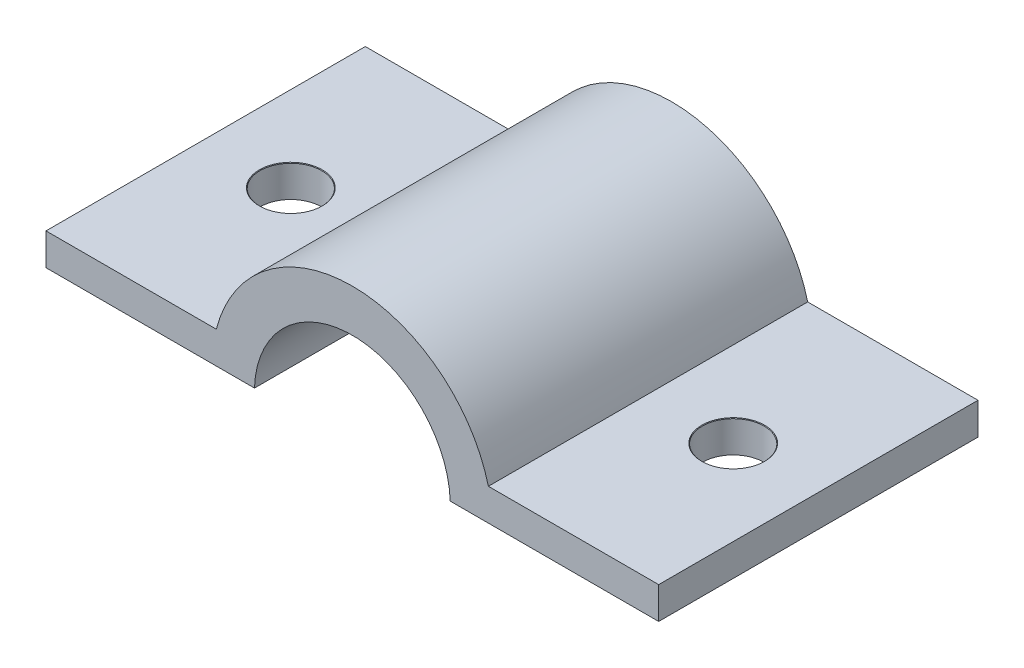
ISO-10303-21;
HEADER;
FILE_DESCRIPTION(('STEP AP214'),'2;1');
FILE_NAME('part.step','',(''),(''),'','','');
FILE_SCHEMA(('AUTOMOTIVE_DESIGN { 1 0 10303 214 1 1 1 1 }'));
ENDSEC;
DATA;
#1=APPLICATION_CONTEXT('core data for automotive mechanical design processes');
#2=APPLICATION_PROTOCOL_DEFINITION('international standard','automotive_design',2000,#1);
#3=PRODUCT_CONTEXT('',#1,'mechanical');
#4=PRODUCT('Part','Part','',(#3));
#5=PRODUCT_RELATED_PRODUCT_CATEGORY('part','',(#4));
#6=PRODUCT_DEFINITION_FORMATION('','',#4);
#7=PRODUCT_DEFINITION_CONTEXT('part definition',#1,'design');
#8=PRODUCT_DEFINITION('design','',#6,#7);
#9=PRODUCT_DEFINITION_SHAPE('','',#8);
#10=(LENGTH_UNIT() NAMED_UNIT(*) SI_UNIT(.MILLI.,.METRE.));
#11=(NAMED_UNIT(*) PLANE_ANGLE_UNIT() SI_UNIT($,.RADIAN.));
#12=(NAMED_UNIT(*) SI_UNIT($,.STERADIAN.) SOLID_ANGLE_UNIT());
#13=UNCERTAINTY_MEASURE_WITH_UNIT(LENGTH_MEASURE(1.E-05),#10,'distance_accuracy_value','');
#14=(GEOMETRIC_REPRESENTATION_CONTEXT(3) GLOBAL_UNCERTAINTY_ASSIGNED_CONTEXT((#13)) GLOBAL_UNIT_ASSIGNED_CONTEXT((#10,
#11,#12)) REPRESENTATION_CONTEXT('',''));
#15=CARTESIAN_POINT('',(0.,0.,0.));
#16=DIRECTION('',(0.,0.,1.));
#17=DIRECTION('',(1.,0.,0.));
#18=AXIS2_PLACEMENT_3D('',#15,#16,#17);
#19=CARTESIAN_POINT('',(-14.3904225212422,0.,15.));
#20=DIRECTION('',(1.,0.,0.));
#21=DIRECTION('',(0.,0.,-1.));
#22=AXIS2_PLACEMENT_3D('',#19,#20,#21);
#23=PLANE('',#22);
#24=DIRECTION('',(0.,-1.,0.));
#25=VECTOR('',#24,1.);
#26=CARTESIAN_POINT('',(-14.3904225212422,0.,0.));
#27=LINE('',#26,#25);
#28=CARTESIAN_POINT('',(-14.3904225212422,1.5,0.));
#29=VERTEX_POINT('',#28);
#30=CARTESIAN_POINT('',(-14.3904225212422,0.,0.));
#31=VERTEX_POINT('',#30);
#32=EDGE_CURVE('E137',#29,#31,#27,.T.);
#33=ORIENTED_EDGE('',*,*,#32,.T.);
#34=DIRECTION('',(0.,0.,-1.));
#35=VECTOR('',#34,1.);
#36=CARTESIAN_POINT('',(-14.3904225212422,0.,15.));
#37=LINE('',#36,#35);
#38=CARTESIAN_POINT('',(-14.3904225212422,0.,15.));
#39=VERTEX_POINT('',#38);
#40=EDGE_CURVE('E11',#39,#31,#37,.T.);
#41=ORIENTED_EDGE('',*,*,#40,.F.);
#42=DIRECTION('',(0.,-1.,0.));
#43=VECTOR('',#42,1.);
#44=CARTESIAN_POINT('',(-14.3904225212422,0.,15.));
#45=LINE('',#44,#43);
#46=CARTESIAN_POINT('',(-14.3904225212422,1.5,15.));
#47=VERTEX_POINT('',#46);
#48=EDGE_CURVE('E152',#47,#39,#45,.T.);
#49=ORIENTED_EDGE('',*,*,#48,.F.);
#50=DIRECTION('',(0.,0.,-1.));
#51=VECTOR('',#50,1.);
#52=CARTESIAN_POINT('',(-14.3904225212422,1.5,15.));
#53=LINE('',#52,#51);
#54=EDGE_CURVE('E133',#47,#29,#53,.T.);
#55=ORIENTED_EDGE('',*,*,#54,.T.);
#56=EDGE_LOOP('',(#33,#41,#49,#55));
#57=FACE_BOUND('',#56,.T.);
#58=ADVANCED_FACE('F41',(#57),#23,.F.);
#59=CARTESIAN_POINT('',(-14.3904225212422,0.,15.));
#60=DIRECTION('',(0.,1.,0.));
#61=DIRECTION('',(0.,0.,1.));
#62=AXIS2_PLACEMENT_3D('',#59,#60,#61);
#63=PLANE('',#62);
#64=CARTESIAN_POINT('',(-10.3904225212422,0.,7.5));
#65=DIRECTION('',(0.,1.,0.));
#66=DIRECTION('',(0.,0.,1.));
#67=AXIS2_PLACEMENT_3D('',#64,#65,#66);
#68=CIRCLE('',#67,1.45);
#69=CARTESIAN_POINT('',(-10.3904225212422,0.,8.95));
#70=VERTEX_POINT('',#69);
#71=EDGE_CURVE('E193',#70,#70,#68,.T.);
#72=ORIENTED_EDGE('',*,*,#71,.T.);
#73=EDGE_LOOP('',(#72));
#74=FACE_BOUND('',#73,.T.);
#75=DIRECTION('',(1.,0.,0.));
#76=VECTOR('',#75,1.);
#77=CARTESIAN_POINT('',(-14.3904225212422,0.,0.));
#78=LINE('',#77,#76);
#79=CARTESIAN_POINT('',(-4.59755369734819,0.,0.));
#80=VERTEX_POINT('',#79);
#81=EDGE_CURVE('E140',#31,#80,#78,.T.);
#82=ORIENTED_EDGE('',*,*,#81,.T.);
#83=DIRECTION('',(0.,0.,-1.));
#84=VECTOR('',#83,1.);
#85=CARTESIAN_POINT('',(-4.59755369734819,0.,15.));
#86=LINE('',#85,#84);
#87=CARTESIAN_POINT('',(-4.59755369734819,0.,15.));
#88=VERTEX_POINT('',#87);
#89=EDGE_CURVE('E49',#88,#80,#86,.T.);
#90=ORIENTED_EDGE('',*,*,#89,.F.);
#91=DIRECTION('',(1.,0.,0.));
#92=VECTOR('',#91,1.);
#93=CARTESIAN_POINT('',(-14.3904225212422,0.,15.));
#94=LINE('',#93,#92);
#95=EDGE_CURVE('E100',#39,#88,#94,.T.);
#96=ORIENTED_EDGE('',*,*,#95,.F.);
#97=ORIENTED_EDGE('',*,*,#40,.T.);
#98=EDGE_LOOP('',(#82,#90,#96,#97));
#99=FACE_BOUND('',#98,.T.);
#100=ADVANCED_FACE('F218',(#74,#99),#63,.F.);
#101=CARTESIAN_POINT('',(0.,-0.15,15.));
#102=DIRECTION('',(0.,0.,-1.));
#103=DIRECTION('',(-1.,0.,0.));
#104=AXIS2_PLACEMENT_3D('',#101,#102,#103);
#105=CYLINDRICAL_SURFACE('',#104,4.6);
#106=CARTESIAN_POINT('',(0.,-0.15,0.));
#107=DIRECTION('',(0.,0.,-1.));
#108=DIRECTION('',(-1.,0.,0.));
#109=AXIS2_PLACEMENT_3D('',#106,#107,#108);
#110=CIRCLE('',#109,4.6);
#111=CARTESIAN_POINT('',(4.59755369734819,0.,0.));
#112=VERTEX_POINT('',#111);
#113=EDGE_CURVE('E143',#80,#112,#110,.T.);
#114=ORIENTED_EDGE('',*,*,#113,.T.);
#115=DIRECTION('',(0.,0.,-1.));
#116=VECTOR('',#115,1.);
#117=CARTESIAN_POINT('',(4.59755369734819,0.,15.));
#118=LINE('',#117,#116);
#119=CARTESIAN_POINT('',(4.59755369734819,0.,15.));
#120=VERTEX_POINT('',#119);
#121=EDGE_CURVE('E159',#120,#112,#118,.T.);
#122=ORIENTED_EDGE('',*,*,#121,.F.);
#123=CARTESIAN_POINT('',(0.,-0.15,15.));
#124=DIRECTION('',(0.,0.,-1.));
#125=DIRECTION('',(-1.,0.,0.));
#126=AXIS2_PLACEMENT_3D('',#123,#124,#125);
#127=CIRCLE('',#126,4.6);
#128=EDGE_CURVE('E167',#88,#120,#127,.T.);
#129=ORIENTED_EDGE('',*,*,#128,.F.);
#130=ORIENTED_EDGE('',*,*,#89,.T.);
#131=EDGE_LOOP('',(#114,#122,#129,#130));
#132=FACE_BOUND('',#131,.T.);
#133=ADVANCED_FACE('F165',(#132),#105,.F.);
#134=CARTESIAN_POINT('',(4.59755369734819,0.,15.));
#135=DIRECTION('',(0.,1.,0.));
#136=DIRECTION('',(0.,0.,1.));
#137=AXIS2_PLACEMENT_3D('',#134,#135,#136);
#138=PLANE('',#137);
#139=CARTESIAN_POINT('',(10.3904225212422,0.,7.5));
#140=DIRECTION('',(0.,1.,0.));
#141=DIRECTION('',(0.,0.,1.));
#142=AXIS2_PLACEMENT_3D('',#139,#140,#141);
#143=CIRCLE('',#142,1.45);
#144=CARTESIAN_POINT('',(10.3904225212422,0.,8.95));
#145=VERTEX_POINT('',#144);
#146=EDGE_CURVE('E141',#145,#145,#143,.T.);
#147=ORIENTED_EDGE('',*,*,#146,.T.);
#148=EDGE_LOOP('',(#147));
#149=FACE_BOUND('',#148,.T.);
#150=DIRECTION('',(1.,0.,0.));
#151=VECTOR('',#150,1.);
#152=CARTESIAN_POINT('',(4.59755369734819,0.,0.));
#153=LINE('',#152,#151);
#154=CARTESIAN_POINT('',(14.3904225212422,0.,0.));
#155=VERTEX_POINT('',#154);
#156=EDGE_CURVE('E145',#112,#155,#153,.T.);
#157=ORIENTED_EDGE('',*,*,#156,.T.);
#158=DIRECTION('',(0.,0.,-1.));
#159=VECTOR('',#158,1.);
#160=CARTESIAN_POINT('',(14.3904225212422,0.,15.));
#161=LINE('',#160,#159);
#162=CARTESIAN_POINT('',(14.3904225212422,0.,15.));
#163=VERTEX_POINT('',#162);
#164=EDGE_CURVE('E156',#163,#155,#161,.T.);
#165=ORIENTED_EDGE('',*,*,#164,.F.);
#166=DIRECTION('',(1.,0.,0.));
#167=VECTOR('',#166,1.);
#168=CARTESIAN_POINT('',(4.59755369734819,0.,15.));
#169=LINE('',#168,#167);
#170=EDGE_CURVE('E179',#120,#163,#169,.T.);
#171=ORIENTED_EDGE('',*,*,#170,.F.);
#172=ORIENTED_EDGE('',*,*,#121,.T.);
#173=EDGE_LOOP('',(#157,#165,#171,#172));
#174=FACE_BOUND('',#173,.T.);
#175=ADVANCED_FACE('F175',(#149,#174),#138,.F.);
#176=CARTESIAN_POINT('',(14.3904225212422,1.5,15.));
#177=DIRECTION('',(-1.,0.,0.));
#178=DIRECTION('',(0.,0.,1.));
#179=AXIS2_PLACEMENT_3D('',#176,#177,#178);
#180=PLANE('',#179);
#181=DIRECTION('',(0.,1.,0.));
#182=VECTOR('',#181,1.);
#183=CARTESIAN_POINT('',(14.3904225212422,1.5,0.));
#184=LINE('',#183,#182);
#185=CARTESIAN_POINT('',(14.3904225212422,1.5,0.));
#186=VERTEX_POINT('',#185);
#187=EDGE_CURVE('E147',#155,#186,#184,.T.);
#188=ORIENTED_EDGE('',*,*,#187,.T.);
#189=DIRECTION('',(0.,0.,-1.));
#190=VECTOR('',#189,1.);
#191=CARTESIAN_POINT('',(14.3904225212422,1.5,15.));
#192=LINE('',#191,#190);
#193=CARTESIAN_POINT('',(14.3904225212422,1.5,15.));
#194=VERTEX_POINT('',#193);
#195=EDGE_CURVE('E128',#194,#186,#192,.T.);
#196=ORIENTED_EDGE('',*,*,#195,.F.);
#197=DIRECTION('',(0.,1.,0.));
#198=VECTOR('',#197,1.);
#199=CARTESIAN_POINT('',(14.3904225212422,1.5,15.));
#200=LINE('',#199,#198);
#201=EDGE_CURVE('E119',#163,#194,#200,.T.);
#202=ORIENTED_EDGE('',*,*,#201,.F.);
#203=ORIENTED_EDGE('',*,*,#164,.T.);
#204=EDGE_LOOP('',(#188,#196,#202,#203));
#205=FACE_BOUND('',#204,.T.);
#206=ADVANCED_FACE('F178',(#205),#180,.F.);
#207=CARTESIAN_POINT('',(6.39042252124224,1.5,15.));
#208=DIRECTION('',(0.,-1.,0.));
#209=DIRECTION('',(0.,0.,-1.));
#210=AXIS2_PLACEMENT_3D('',#207,#208,#209);
#211=PLANE('',#210);
#212=CARTESIAN_POINT('',(10.3904225212422,1.5,7.5));
#213=DIRECTION('',(0.,1.,0.));
#214=DIRECTION('',(0.,0.,1.));
#215=AXIS2_PLACEMENT_3D('',#212,#213,#214);
#216=CIRCLE('',#215,1.475);
#217=CARTESIAN_POINT('',(10.3904225212422,1.5,8.975));
#218=VERTEX_POINT('',#217);
#219=EDGE_CURVE('E190',#218,#218,#216,.T.);
#220=ORIENTED_EDGE('',*,*,#219,.F.);
#221=EDGE_LOOP('',(#220));
#222=FACE_BOUND('',#221,.T.);
#223=DIRECTION('',(-1.,0.,0.));
#224=VECTOR('',#223,1.);
#225=CARTESIAN_POINT('',(6.39042252124224,1.5,0.));
#226=LINE('',#225,#224);
#227=CARTESIAN_POINT('',(6.39042252124224,1.5,0.));
#228=VERTEX_POINT('',#227);
#229=EDGE_CURVE('E127',#186,#228,#226,.T.);
#230=ORIENTED_EDGE('',*,*,#229,.T.);
#231=DIRECTION('',(0.,0.,-1.));
#232=VECTOR('',#231,1.);
#233=CARTESIAN_POINT('',(6.39042252124224,1.5,15.));
#234=LINE('',#233,#232);
#235=CARTESIAN_POINT('',(6.39042252124224,1.5,15.));
#236=VERTEX_POINT('',#235);
#237=EDGE_CURVE('E124',#236,#228,#234,.T.);
#238=ORIENTED_EDGE('',*,*,#237,.F.);
#239=DIRECTION('',(-1.,0.,0.));
#240=VECTOR('',#239,1.);
#241=CARTESIAN_POINT('',(6.39042252124224,1.5,15.));
#242=LINE('',#241,#240);
#243=EDGE_CURVE('E113',#194,#236,#242,.T.);
#244=ORIENTED_EDGE('',*,*,#243,.F.);
#245=ORIENTED_EDGE('',*,*,#195,.T.);
#246=EDGE_LOOP('',(#230,#238,#244,#245));
#247=FACE_BOUND('',#246,.T.);
#248=ADVANCED_FACE('F125',(#222,#247),#211,.F.);
#249=CARTESIAN_POINT('',(0.,-0.15,15.));
#250=DIRECTION('',(0.,0.,-1.));
#251=DIRECTION('',(-1.,0.,0.));
#252=AXIS2_PLACEMENT_3D('',#249,#250,#251);
#253=CYLINDRICAL_SURFACE('',#252,6.6);
#254=CARTESIAN_POINT('',(0.,-0.15,0.));
#255=DIRECTION('',(0.,0.,1.));
#256=DIRECTION('',(-1.,0.,0.));
#257=AXIS2_PLACEMENT_3D('',#254,#255,#256);
#258=CIRCLE('',#257,6.6);
#259=CARTESIAN_POINT('',(-6.39042252124224,1.5,0.));
#260=VERTEX_POINT('',#259);
#261=EDGE_CURVE('E86',#228,#260,#258,.T.);
#262=ORIENTED_EDGE('',*,*,#261,.T.);
#263=DIRECTION('',(0.,0.,-1.));
#264=VECTOR('',#263,1.);
#265=CARTESIAN_POINT('',(-6.39042252124224,1.5,15.));
#266=LINE('',#265,#264);
#267=CARTESIAN_POINT('',(-6.39042252124224,1.5,15.));
#268=VERTEX_POINT('',#267);
#269=EDGE_CURVE('E129',#268,#260,#266,.T.);
#270=ORIENTED_EDGE('',*,*,#269,.F.);
#271=CARTESIAN_POINT('',(0.,-0.15,15.));
#272=DIRECTION('',(0.,0.,1.));
#273=DIRECTION('',(-1.,0.,0.));
#274=AXIS2_PLACEMENT_3D('',#271,#272,#273);
#275=CIRCLE('',#274,6.6);
#276=EDGE_CURVE('E117',#236,#268,#275,.T.);
#277=ORIENTED_EDGE('',*,*,#276,.F.);
#278=ORIENTED_EDGE('',*,*,#237,.T.);
#279=EDGE_LOOP('',(#262,#270,#277,#278));
#280=FACE_BOUND('',#279,.T.);
#281=ADVANCED_FACE('F131',(#280),#253,.T.);
#282=CARTESIAN_POINT('',(-14.3904225212422,1.5,15.));
#283=DIRECTION('',(0.,-1.,0.));
#284=DIRECTION('',(0.,0.,-1.));
#285=AXIS2_PLACEMENT_3D('',#282,#283,#284);
#286=PLANE('',#285);
#287=CARTESIAN_POINT('',(-10.3904225212422,1.5,7.5));
#288=DIRECTION('',(0.,1.,0.));
#289=DIRECTION('',(0.,0.,1.));
#290=AXIS2_PLACEMENT_3D('',#287,#288,#289);
#291=CIRCLE('',#290,1.475);
#292=CARTESIAN_POINT('',(-10.3904225212422,1.5,8.975));
#293=VERTEX_POINT('',#292);
#294=EDGE_CURVE('E199',#293,#293,#291,.T.);
#295=ORIENTED_EDGE('',*,*,#294,.F.);
#296=EDGE_LOOP('',(#295));
#297=FACE_BOUND('',#296,.T.);
#298=DIRECTION('',(-1.,0.,0.));
#299=VECTOR('',#298,1.);
#300=CARTESIAN_POINT('',(-14.3904225212422,1.5,0.));
#301=LINE('',#300,#299);
#302=EDGE_CURVE('E92',#260,#29,#301,.T.);
#303=ORIENTED_EDGE('',*,*,#302,.T.);
#304=ORIENTED_EDGE('',*,*,#54,.F.);
#305=DIRECTION('',(-1.,0.,0.));
#306=VECTOR('',#305,1.);
#307=CARTESIAN_POINT('',(-14.3904225212422,1.5,15.));
#308=LINE('',#307,#306);
#309=EDGE_CURVE('E57',#268,#47,#308,.T.);
#310=ORIENTED_EDGE('',*,*,#309,.F.);
#311=ORIENTED_EDGE('',*,*,#269,.T.);
#312=EDGE_LOOP('',(#303,#304,#310,#311));
#313=FACE_BOUND('',#312,.T.);
#314=ADVANCED_FACE('F205',(#297,#313),#286,.F.);
#315=CARTESIAN_POINT('',(0.,-0.15,15.));
#316=DIRECTION('',(0.,0.,-1.));
#317=DIRECTION('',(-1.,0.,0.));
#318=AXIS2_PLACEMENT_3D('',#315,#316,#317);
#319=PLANE('',#318);
#320=ORIENTED_EDGE('',*,*,#48,.T.);
#321=ORIENTED_EDGE('',*,*,#95,.T.);
#322=ORIENTED_EDGE('',*,*,#128,.T.);
#323=ORIENTED_EDGE('',*,*,#170,.T.);
#324=ORIENTED_EDGE('',*,*,#201,.T.);
#325=ORIENTED_EDGE('',*,*,#243,.T.);
#326=ORIENTED_EDGE('',*,*,#276,.T.);
#327=ORIENTED_EDGE('',*,*,#309,.T.);
#328=EDGE_LOOP('',(#320,#321,#322,#323,#324,#325,#326,#327));
#329=FACE_BOUND('',#328,.T.);
#330=ADVANCED_FACE('F115',(#329),#319,.F.);
#331=CARTESIAN_POINT('',(0.,-0.15,0.));
#332=DIRECTION('',(0.,0.,-1.));
#333=DIRECTION('',(-1.,0.,0.));
#334=AXIS2_PLACEMENT_3D('',#331,#332,#333);
#335=PLANE('',#334);
#336=ORIENTED_EDGE('',*,*,#32,.F.);
#337=ORIENTED_EDGE('',*,*,#302,.F.);
#338=ORIENTED_EDGE('',*,*,#261,.F.);
#339=ORIENTED_EDGE('',*,*,#229,.F.);
#340=ORIENTED_EDGE('',*,*,#187,.F.);
#341=ORIENTED_EDGE('',*,*,#156,.F.);
#342=ORIENTED_EDGE('',*,*,#113,.F.);
#343=ORIENTED_EDGE('',*,*,#81,.F.);
#344=EDGE_LOOP('',(#336,#337,#338,#339,#340,#341,#342,#343));
#345=FACE_BOUND('',#344,.T.);
#346=ADVANCED_FACE('F171',(#345),#335,.T.);
#347=CARTESIAN_POINT('',(10.3904225212422,1.5,7.5));
#348=DIRECTION('',(0.,1.,0.));
#349=DIRECTION('',(0.,0.,1.));
#350=AXIS2_PLACEMENT_3D('',#347,#348,#349);
#351=CYLINDRICAL_SURFACE('',#350,1.45);
#352=ORIENTED_EDGE('',*,*,#146,.F.);
#353=EDGE_LOOP('',(#352));
#354=FACE_BOUND('',#353,.T.);
#355=CARTESIAN_POINT('',(10.3904225212422,1.475,7.5));
#356=DIRECTION('',(0.,1.,0.));
#357=DIRECTION('',(0.,0.,1.));
#358=AXIS2_PLACEMENT_3D('',#355,#356,#357);
#359=CIRCLE('',#358,1.45);
#360=CARTESIAN_POINT('',(10.3904225212422,1.475,8.95));
#361=VERTEX_POINT('',#360);
#362=EDGE_CURVE('E187',#361,#361,#359,.T.);
#363=ORIENTED_EDGE('',*,*,#362,.T.);
#364=EDGE_LOOP('',(#363));
#365=FACE_BOUND('',#364,.T.);
#366=ADVANCED_FACE('F245',(#354,#365),#351,.F.);
#367=CARTESIAN_POINT('',(10.3904225212422,1.5,7.5));
#368=DIRECTION('',(0.,1.,0.));
#369=DIRECTION('',(0.,0.,1.));
#370=AXIS2_PLACEMENT_3D('',#367,#368,#369);
#371=CONICAL_SURFACE('',#370,1.475,0.785398163397518);
#372=ORIENTED_EDGE('',*,*,#362,.F.);
#373=EDGE_LOOP('',(#372));
#374=FACE_BOUND('',#373,.T.);
#375=ORIENTED_EDGE('',*,*,#219,.T.);
#376=EDGE_LOOP('',(#375));
#377=FACE_BOUND('',#376,.T.);
#378=ADVANCED_FACE('F242',(#374,#377),#371,.F.);
#379=CARTESIAN_POINT('',(-10.3904225212422,1.5,7.5));
#380=DIRECTION('',(0.,1.,0.));
#381=DIRECTION('',(0.,0.,1.));
#382=AXIS2_PLACEMENT_3D('',#379,#380,#381);
#383=CYLINDRICAL_SURFACE('',#382,1.45);
#384=ORIENTED_EDGE('',*,*,#71,.F.);
#385=EDGE_LOOP('',(#384));
#386=FACE_BOUND('',#385,.T.);
#387=CARTESIAN_POINT('',(-10.3904225212422,1.475,7.5));
#388=DIRECTION('',(0.,1.,0.));
#389=DIRECTION('',(0.,0.,1.));
#390=AXIS2_PLACEMENT_3D('',#387,#388,#389);
#391=CIRCLE('',#390,1.45);
#392=CARTESIAN_POINT('',(-10.3904225212422,1.475,8.95));
#393=VERTEX_POINT('',#392);
#394=EDGE_CURVE('E196',#393,#393,#391,.T.);
#395=ORIENTED_EDGE('',*,*,#394,.T.);
#396=EDGE_LOOP('',(#395));
#397=FACE_BOUND('',#396,.T.);
#398=ADVANCED_FACE('F244',(#386,#397),#383,.F.);
#399=CARTESIAN_POINT('',(-10.3904225212422,1.5,7.5));
#400=DIRECTION('',(0.,1.,0.));
#401=DIRECTION('',(0.,0.,1.));
#402=AXIS2_PLACEMENT_3D('',#399,#400,#401);
#403=CONICAL_SURFACE('',#402,1.475,0.785398163397518);
#404=ORIENTED_EDGE('',*,*,#394,.F.);
#405=EDGE_LOOP('',(#404));
#406=FACE_BOUND('',#405,.T.);
#407=ORIENTED_EDGE('',*,*,#294,.T.);
#408=EDGE_LOOP('',(#407));
#409=FACE_BOUND('',#408,.T.);
#410=ADVANCED_FACE('F203',(#406,#409),#403,.F.);
#411=CLOSED_SHELL('',(#58,#100,#133,#175,#206,#248,#281,#314,#330,#346,#366,#378,#398,#410));
#412=MANIFOLD_SOLID_BREP('B2',#411);
#413=ADVANCED_BREP_SHAPE_REPRESENTATION('',(#18,#412),#14);
#414=SHAPE_DEFINITION_REPRESENTATION(#9,#413);
ENDSEC;
END-ISO-10303-21;
